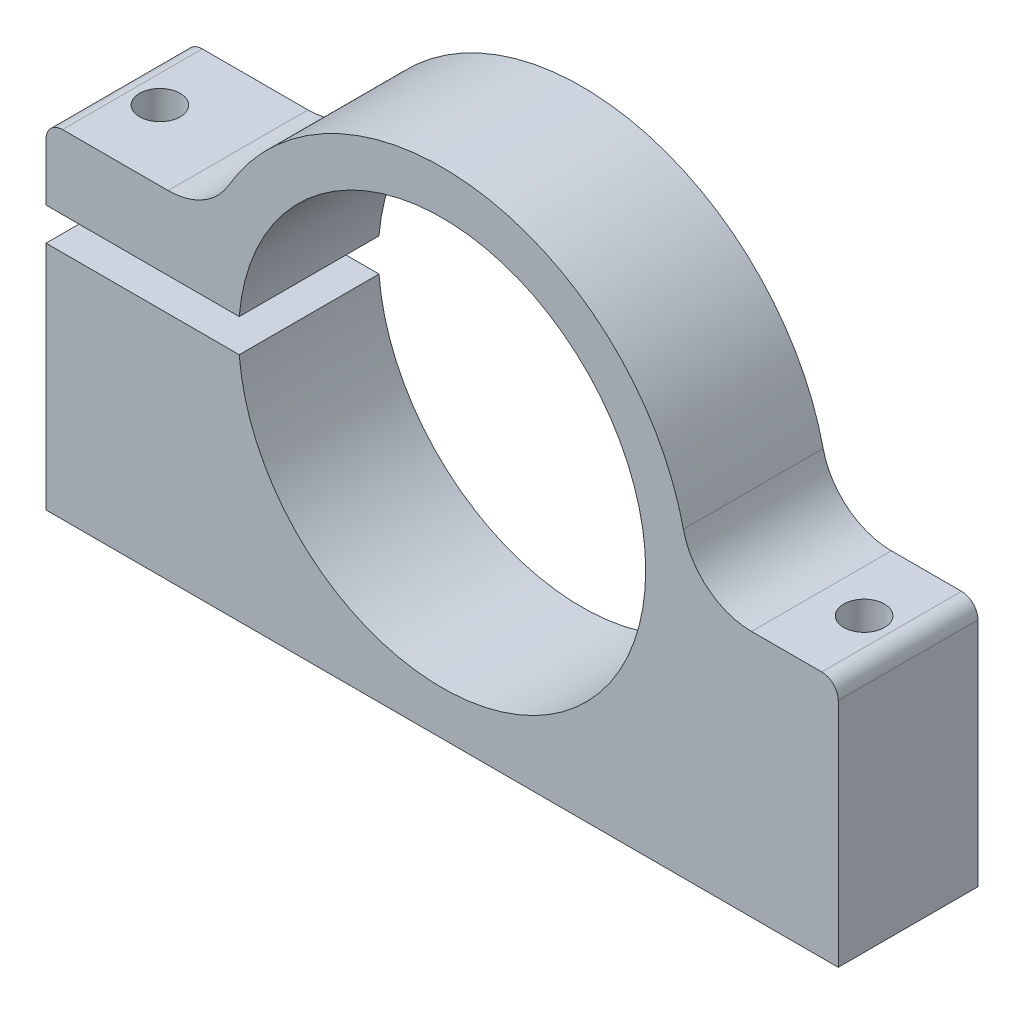
ISO-10303-21;
HEADER;
FILE_DESCRIPTION(('STEP AP214'),'2;1');
FILE_NAME('part.step','',(''),(''),'','','');
FILE_SCHEMA(('AUTOMOTIVE_DESIGN { 1 0 10303 214 1 1 1 1 }'));
ENDSEC;
DATA;
#1=APPLICATION_CONTEXT('core data for automotive mechanical design processes');
#2=APPLICATION_PROTOCOL_DEFINITION('international standard','automotive_design',2000,#1);
#3=PRODUCT_CONTEXT('',#1,'mechanical');
#4=PRODUCT('Part','Part','',(#3));
#5=PRODUCT_RELATED_PRODUCT_CATEGORY('part','',(#4));
#6=PRODUCT_DEFINITION_FORMATION('','',#4);
#7=PRODUCT_DEFINITION_CONTEXT('part definition',#1,'design');
#8=PRODUCT_DEFINITION('design','',#6,#7);
#9=PRODUCT_DEFINITION_SHAPE('','',#8);
#10=(LENGTH_UNIT() NAMED_UNIT(*) SI_UNIT(.MILLI.,.METRE.));
#11=(NAMED_UNIT(*) PLANE_ANGLE_UNIT() SI_UNIT($,.RADIAN.));
#12=(NAMED_UNIT(*) SI_UNIT($,.STERADIAN.) SOLID_ANGLE_UNIT());
#13=UNCERTAINTY_MEASURE_WITH_UNIT(LENGTH_MEASURE(1.E-05),#10,'distance_accuracy_value','');
#14=(GEOMETRIC_REPRESENTATION_CONTEXT(3) GLOBAL_UNCERTAINTY_ASSIGNED_CONTEXT((#13)) GLOBAL_UNIT_ASSIGNED_CONTEXT((#10,
#11,#12)) REPRESENTATION_CONTEXT('',''));
#15=CARTESIAN_POINT('',(0.,0.,0.));
#16=DIRECTION('',(0.,0.,1.));
#17=DIRECTION('',(1.,0.,0.));
#18=AXIS2_PLACEMENT_3D('',#15,#16,#17);
#19=CARTESIAN_POINT('',(2.74268845080234,-4.09970818546671,-8.09817712258498));
#20=DIRECTION('',(0.,1.,0.));
#21=DIRECTION('',(-1.,0.,0.));
#22=AXIS2_PLACEMENT_3D('',#19,#20,#21);
#23=PLANE('',#22);
#24=CARTESIAN_POINT('',(-0.495594242374321,-4.09970818546671,-5.94949587258498));
#25=DIRECTION('',(0.,1.,0.));
#26=DIRECTION('',(-1.,0.,0.));
#27=AXIS2_PLACEMENT_3D('',#24,#25,#26);
#28=CIRCLE('',#27,0.62599375);
#29=CARTESIAN_POINT('',(-1.12158799237432,-4.09970818546671,-5.94949587258498));
#30=VERTEX_POINT('',#29);
#31=EDGE_CURVE('E158',#30,#30,#28,.T.);
#32=ORIENTED_EDGE('',*,*,#31,.T.);
#33=EDGE_LOOP('',(#32));
#34=FACE_BOUND('',#33,.T.);
#35=DIRECTION('',(-1.,0.,0.));
#36=VECTOR('',#35,1.);
#37=CARTESIAN_POINT('',(2.74268845080234,-4.09970818546671,-3.80081462258498));
#38=LINE('',#37,#36);
#39=CARTESIAN_POINT('',(4.09307904615272,-4.09970818546671,-3.80081462258498));
#40=VERTEX_POINT('',#39);
#41=CARTESIAN_POINT('',(-1.84909424237432,-4.09970818546671,-3.80081462258498));
#42=VERTEX_POINT('',#41);
#43=EDGE_CURVE('E147',#40,#42,#38,.T.);
#44=ORIENTED_EDGE('',*,*,#43,.T.);
#45=DIRECTION('',(0.,0.,1.));
#46=VECTOR('',#45,1.);
#47=CARTESIAN_POINT('',(-1.84909424237432,-4.09970818546671,-8.09817712258498));
#48=LINE('',#47,#46);
#49=CARTESIAN_POINT('',(-1.84909424237432,-4.09970818546671,-8.09817712258498));
#50=VERTEX_POINT('',#49);
#51=EDGE_CURVE('E207',#50,#42,#48,.T.);
#52=ORIENTED_EDGE('',*,*,#51,.F.);
#53=DIRECTION('',(-1.,0.,0.));
#54=VECTOR('',#53,1.);
#55=CARTESIAN_POINT('',(2.74268845080234,-4.09970818546671,-8.09817712258498));
#56=LINE('',#55,#54);
#57=CARTESIAN_POINT('',(4.09307904615272,-4.09970818546671,-8.09817712258498));
#58=VERTEX_POINT('',#57);
#59=EDGE_CURVE('E186',#58,#50,#56,.T.);
#60=ORIENTED_EDGE('',*,*,#59,.F.);
#61=DIRECTION('',(0.,0.,1.));
#62=VECTOR('',#61,1.);
#63=CARTESIAN_POINT('',(4.09307904615272,-4.09970818546671,-8.09817712258498));
#64=LINE('',#63,#62);
#65=EDGE_CURVE('E157',#58,#40,#64,.T.);
#66=ORIENTED_EDGE('',*,*,#65,.T.);
#67=EDGE_LOOP('',(#44,#52,#60,#66));
#68=FACE_BOUND('',#67,.T.);
#69=ADVANCED_FACE('F36',(#34,#68),#23,.F.);
#70=CARTESIAN_POINT('',(-1.84909424237432,-4.09970818546671,-8.09817712258498));
#71=DIRECTION('',(1.,0.,0.));
#72=DIRECTION('',(0.,0.,-1.));
#73=AXIS2_PLACEMENT_3D('',#70,#71,#72);
#74=PLANE('',#73);
#75=DIRECTION('',(0.,1.,0.));
#76=VECTOR('',#75,1.);
#77=CARTESIAN_POINT('',(-1.84909424237432,-4.09970818546671,-3.80081462258498));
#78=LINE('',#77,#76);
#79=CARTESIAN_POINT('',(-1.84909424237432,-2.34319761645771,-3.80081462258498));
#80=VERTEX_POINT('',#79);
#81=EDGE_CURVE('E204',#42,#80,#78,.T.);
#82=ORIENTED_EDGE('',*,*,#81,.T.);
#83=DIRECTION('',(0.,0.,1.));
#84=VECTOR('',#83,1.);
#85=CARTESIAN_POINT('',(-1.84909424237432,-2.34319761645771,-8.09817712258498));
#86=LINE('',#85,#84);
#87=CARTESIAN_POINT('',(-1.84909424237432,-2.34319761645771,-8.09817712258498));
#88=VERTEX_POINT('',#87);
#89=EDGE_CURVE('E44',#80,#88,#86,.F.);
#90=ORIENTED_EDGE('',*,*,#89,.T.);
#91=DIRECTION('',(0.,1.,0.));
#92=VECTOR('',#91,1.);
#93=CARTESIAN_POINT('',(-1.84909424237432,-4.09970818546671,-8.09817712258498));
#94=LINE('',#93,#92);
#95=EDGE_CURVE('E184',#50,#88,#94,.T.);
#96=ORIENTED_EDGE('',*,*,#95,.F.);
#97=ORIENTED_EDGE('',*,*,#51,.T.);
#98=EDGE_LOOP('',(#82,#90,#96,#97));
#99=FACE_BOUND('',#98,.T.);
#100=ADVANCED_FACE('F328',(#99),#74,.F.);
#101=CARTESIAN_POINT('',(-1.84909424237432,-1.83563511645771,-8.09817712258498));
#102=DIRECTION('',(0.,-1.,0.));
#103=DIRECTION('',(1.,0.,0.));
#104=AXIS2_PLACEMENT_3D('',#101,#102,#103);
#105=PLANE('',#104);
#106=CARTESIAN_POINT('',(-0.495594242374319,-1.83563511645771,-5.94949587258498));
#107=DIRECTION('',(0.,1.,0.));
#108=DIRECTION('',(-1.,0.,0.));
#109=AXIS2_PLACEMENT_3D('',#106,#107,#108);
#110=CIRCLE('',#109,0.62599375);
#111=CARTESIAN_POINT('',(-1.12158799237432,-1.83563511645771,-5.94949587258498));
#112=VERTEX_POINT('',#111);
#113=EDGE_CURVE('E297',#112,#112,#110,.T.);
#114=ORIENTED_EDGE('',*,*,#113,.F.);
#115=EDGE_LOOP('',(#114));
#116=FACE_BOUND('',#115,.T.);
#117=DIRECTION('',(1.,0.,0.));
#118=VECTOR('',#117,1.);
#119=CARTESIAN_POINT('',(-1.84909424237432,-1.83563511645771,-8.09817712258498));
#120=LINE('',#119,#118);
#121=CARTESIAN_POINT('',(-1.34153174237432,-1.83563511645771,-8.09817712258498));
#122=VERTEX_POINT('',#121);
#123=CARTESIAN_POINT('',(1.90878655852523,-1.83563511645771,-8.09817712258498));
#124=VERTEX_POINT('',#123);
#125=EDGE_CURVE('E182',#122,#124,#120,.T.);
#126=ORIENTED_EDGE('',*,*,#125,.F.);
#127=DIRECTION('',(0.,0.,1.));
#128=VECTOR('',#127,1.);
#129=CARTESIAN_POINT('',(-1.34153174237432,-1.83563511645771,-8.09817712258498));
#130=LINE('',#129,#128);
#131=CARTESIAN_POINT('',(-1.34153174237432,-1.83563511645771,-3.80081462258498));
#132=VERTEX_POINT('',#131);
#133=EDGE_CURVE('E249',#122,#132,#130,.T.);
#134=ORIENTED_EDGE('',*,*,#133,.T.);
#135=DIRECTION('',(1.,0.,0.));
#136=VECTOR('',#135,1.);
#137=CARTESIAN_POINT('',(-1.84909424237432,-1.83563511645771,-3.80081462258498));
#138=LINE('',#137,#136);
#139=CARTESIAN_POINT('',(1.90878655852523,-1.83563511645771,-3.80081462258498));
#140=VERTEX_POINT('',#139);
#141=EDGE_CURVE('E202',#132,#140,#138,.T.);
#142=ORIENTED_EDGE('',*,*,#141,.T.);
#143=DIRECTION('',(0.,0.,1.));
#144=VECTOR('',#143,1.);
#145=CARTESIAN_POINT('',(1.90878655852523,-1.83563511645771,-8.09817712258498));
#146=LINE('',#145,#144);
#147=EDGE_CURVE('E232',#140,#124,#146,.F.);
#148=ORIENTED_EDGE('',*,*,#147,.T.);
#149=EDGE_LOOP('',(#126,#134,#142,#148));
#150=FACE_BOUND('',#149,.T.);
#151=ADVANCED_FACE('F255',(#116,#150),#105,.F.);
#152=CARTESIAN_POINT('',(10.3324057576257,-4.60727068546671,-8.09817712258498));
#153=DIRECTION('',(0.,0.,1.));
#154=DIRECTION('',(1.,0.,0.));
#155=AXIS2_PLACEMENT_3D('',#152,#153,#154);
#156=CYLINDRICAL_SURFACE('',#155,7.60667);
#157=CARTESIAN_POINT('',(10.3324057576257,-4.60727068546671,-8.09817712258498));
#158=DIRECTION('',(0.,0.,1.));
#159=DIRECTION('',(1.,0.,0.));
#160=AXIS2_PLACEMENT_3D('',#157,#158,#159);
#161=CIRCLE('',#160,7.60667);
#162=CARTESIAN_POINT('',(17.7522707691359,-2.93185082767969,-8.09817712258498));
#163=VERTEX_POINT('',#162);
#164=CARTESIAN_POINT('',(3.76414493224316,-0.770686499156537,-8.09817712258498));
#165=VERTEX_POINT('',#164);
#166=EDGE_CURVE('E179',#163,#165,#161,.T.);
#167=ORIENTED_EDGE('',*,*,#166,.T.);
#168=DIRECTION('',(0.,0.,1.));
#169=VECTOR('',#168,1.);
#170=CARTESIAN_POINT('',(3.76414493224316,-0.770686499156537,-8.09817712258498));
#171=LINE('',#170,#169);
#172=CARTESIAN_POINT('',(3.76414493224316,-0.770686499156537,-3.80081462258498));
#173=VERTEX_POINT('',#172);
#174=EDGE_CURVE('E229',#165,#173,#171,.T.);
#175=ORIENTED_EDGE('',*,*,#174,.T.);
#176=CARTESIAN_POINT('',(10.3324057576257,-4.60727068546671,-3.80081462258498));
#177=DIRECTION('',(0.,0.,1.));
#178=DIRECTION('',(1.,0.,0.));
#179=AXIS2_PLACEMENT_3D('',#176,#177,#178);
#180=CIRCLE('',#179,7.60667);
#181=CARTESIAN_POINT('',(17.7522707691359,-2.93185082767969,-3.80081462258498));
#182=VERTEX_POINT('',#181);
#183=EDGE_CURVE('E199',#182,#173,#180,.T.);
#184=ORIENTED_EDGE('',*,*,#183,.F.);
#185=DIRECTION('',(0.,0.,1.));
#186=VECTOR('',#185,1.);
#187=CARTESIAN_POINT('',(17.7522707691359,-2.93185082767969,-8.09817712258498));
#188=LINE('',#187,#186);
#189=EDGE_CURVE('E222',#182,#163,#188,.F.);
#190=ORIENTED_EDGE('',*,*,#189,.T.);
#191=EDGE_LOOP('',(#167,#175,#184,#190));
#192=FACE_BOUND('',#191,.T.);
#193=ADVANCED_FACE('F268',(#192),#156,.T.);
#194=CARTESIAN_POINT('',(22.5139057576257,-4.60727068546671,-8.09817712258498));
#195=DIRECTION('',(0.,1.,0.));
#196=DIRECTION('',(-1.,0.,0.));
#197=AXIS2_PLACEMENT_3D('',#194,#195,#196);
#198=PLANE('',#197);
#199=CARTESIAN_POINT('',(21.1604057576257,-4.60727068546671,-5.94949587258498));
#200=DIRECTION('',(0.,1.,0.));
#201=DIRECTION('',(-1.,0.,0.));
#202=AXIS2_PLACEMENT_3D('',#199,#200,#201);
#203=CIRCLE('',#202,0.625993749999999);
#204=CARTESIAN_POINT('',(20.5344120076257,-4.60727068546671,-5.94949587258498));
#205=VERTEX_POINT('',#204);
#206=EDGE_CURVE('E303',#205,#205,#203,.T.);
#207=ORIENTED_EDGE('',*,*,#206,.F.);
#208=EDGE_LOOP('',(#207));
#209=FACE_BOUND('',#208,.T.);
#210=DIRECTION('',(-1.,0.,0.));
#211=VECTOR('',#210,1.);
#212=CARTESIAN_POINT('',(22.5139057576257,-4.60727068546671,-3.80081462258498));
#213=LINE('',#212,#211);
#214=CARTESIAN_POINT('',(22.0063432576257,-4.60727068546671,-3.80081462258498));
#215=VERTEX_POINT('',#214);
#216=CARTESIAN_POINT('',(19.8481845957858,-4.60727068546671,-3.80081462258498));
#217=VERTEX_POINT('',#216);
#218=EDGE_CURVE('E197',#215,#217,#213,.T.);
#219=ORIENTED_EDGE('',*,*,#218,.F.);
#220=DIRECTION('',(0.,0.,1.));
#221=VECTOR('',#220,1.);
#222=CARTESIAN_POINT('',(22.0063432576257,-4.60727068546671,-8.09817712258498));
#223=LINE('',#222,#221);
#224=CARTESIAN_POINT('',(22.0063432576257,-4.60727068546671,-8.09817712258498));
#225=VERTEX_POINT('',#224);
#226=EDGE_CURVE('E245',#215,#225,#223,.F.);
#227=ORIENTED_EDGE('',*,*,#226,.T.);
#228=DIRECTION('',(-1.,0.,0.));
#229=VECTOR('',#228,1.);
#230=CARTESIAN_POINT('',(22.5139057576257,-4.60727068546671,-8.09817712258498));
#231=LINE('',#230,#229);
#232=CARTESIAN_POINT('',(19.8481845957858,-4.60727068546671,-8.09817712258498));
#233=VERTEX_POINT('',#232);
#234=EDGE_CURVE('E177',#225,#233,#231,.T.);
#235=ORIENTED_EDGE('',*,*,#234,.T.);
#236=DIRECTION('',(0.,0.,-1.));
#237=VECTOR('',#236,1.);
#238=CARTESIAN_POINT('',(19.8481845957858,-4.60727068546671,-3.80081462258498));
#239=LINE('',#238,#237);
#240=EDGE_CURVE('E210',#233,#217,#239,.F.);
#241=ORIENTED_EDGE('',*,*,#240,.T.);
#242=EDGE_LOOP('',(#219,#227,#235,#241));
#243=FACE_BOUND('',#242,.T.);
#244=ADVANCED_FACE('F318',(#209,#243),#198,.T.);
#245=CARTESIAN_POINT('',(22.5139057576257,-12.2207081854667,-8.09817712258498));
#246=DIRECTION('',(1.,0.,0.));
#247=DIRECTION('',(0.,1.,0.));
#248=AXIS2_PLACEMENT_3D('',#245,#246,#247);
#249=PLANE('',#248);
#250=DIRECTION('',(0.,1.,0.));
#251=VECTOR('',#250,1.);
#252=CARTESIAN_POINT('',(22.5139057576257,-12.2207081854667,-8.09817712258498));
#253=LINE('',#252,#251);
#254=CARTESIAN_POINT('',(22.5139057576257,-12.2207081854667,-8.09817712258498));
#255=VERTEX_POINT('',#254);
#256=CARTESIAN_POINT('',(22.5139057576257,-5.11483318546671,-8.09817712258498));
#257=VERTEX_POINT('',#256);
#258=EDGE_CURVE('E174',#255,#257,#253,.T.);
#259=ORIENTED_EDGE('',*,*,#258,.T.);
#260=DIRECTION('',(0.,0.,1.));
#261=VECTOR('',#260,1.);
#262=CARTESIAN_POINT('',(22.5139057576257,-5.11483318546671,-8.09817712258498));
#263=LINE('',#262,#261);
#264=CARTESIAN_POINT('',(22.5139057576257,-5.11483318546671,-3.80081462258498));
#265=VERTEX_POINT('',#264);
#266=EDGE_CURVE('E240',#257,#265,#263,.T.);
#267=ORIENTED_EDGE('',*,*,#266,.T.);
#268=DIRECTION('',(0.,1.,0.));
#269=VECTOR('',#268,1.);
#270=CARTESIAN_POINT('',(22.5139057576257,-12.2207081854667,-3.80081462258498));
#271=LINE('',#270,#269);
#272=CARTESIAN_POINT('',(22.5139057576257,-12.2207081854667,-3.80081462258498));
#273=VERTEX_POINT('',#272);
#274=EDGE_CURVE('E194',#273,#265,#271,.T.);
#275=ORIENTED_EDGE('',*,*,#274,.F.);
#276=DIRECTION('',(0.,0.,1.));
#277=VECTOR('',#276,1.);
#278=CARTESIAN_POINT('',(22.5139057576257,-12.2207081854667,-8.09817712258498));
#279=LINE('',#278,#277);
#280=EDGE_CURVE('E211',#255,#273,#279,.T.);
#281=ORIENTED_EDGE('',*,*,#280,.F.);
#282=EDGE_LOOP('',(#259,#267,#275,#281));
#283=FACE_BOUND('',#282,.T.);
#284=ADVANCED_FACE('F284',(#283),#249,.T.);
#285=CARTESIAN_POINT('',(-1.84909424237432,-12.2207081854667,-8.09817712258498));
#286=DIRECTION('',(0.,-1.,0.));
#287=DIRECTION('',(0.,0.,-1.));
#288=AXIS2_PLACEMENT_3D('',#285,#286,#287);
#289=PLANE('',#288);
#290=CARTESIAN_POINT('',(21.1604057576257,-12.2207081854667,-5.94949587258498));
#291=DIRECTION('',(0.,1.,0.));
#292=DIRECTION('',(-1.,0.,0.));
#293=AXIS2_PLACEMENT_3D('',#290,#291,#292);
#294=CIRCLE('',#293,0.625993749999999);
#295=CARTESIAN_POINT('',(20.5344120076257,-12.2207081854667,-5.94949587258498));
#296=VERTEX_POINT('',#295);
#297=EDGE_CURVE('E300',#296,#296,#294,.T.);
#298=ORIENTED_EDGE('',*,*,#297,.T.);
#299=EDGE_LOOP('',(#298));
#300=FACE_BOUND('',#299,.T.);
#301=CARTESIAN_POINT('',(-0.495594242374321,-12.2207081854667,-5.94949587258498));
#302=DIRECTION('',(0.,1.,0.));
#303=DIRECTION('',(-1.,0.,0.));
#304=AXIS2_PLACEMENT_3D('',#301,#302,#303);
#305=CIRCLE('',#304,0.62599375);
#306=CARTESIAN_POINT('',(-1.12158799237432,-12.2207081854667,-5.94949587258498));
#307=VERTEX_POINT('',#306);
#308=EDGE_CURVE('E219',#307,#307,#305,.T.);
#309=ORIENTED_EDGE('',*,*,#308,.T.);
#310=EDGE_LOOP('',(#309));
#311=FACE_BOUND('',#310,.T.);
#312=DIRECTION('',(1.,0.,0.));
#313=VECTOR('',#312,1.);
#314=CARTESIAN_POINT('',(-1.84909424237432,-12.2207081854667,-3.80081462258498));
#315=LINE('',#314,#313);
#316=CARTESIAN_POINT('',(-1.84909424237432,-12.2207081854667,-3.80081462258498));
#317=VERTEX_POINT('',#316);
#318=EDGE_CURVE('E191',#317,#273,#315,.T.);
#319=ORIENTED_EDGE('',*,*,#318,.F.);
#320=DIRECTION('',(0.,0.,1.));
#321=VECTOR('',#320,1.);
#322=CARTESIAN_POINT('',(-1.84909424237432,-12.2207081854667,-8.09817712258498));
#323=LINE('',#322,#321);
#324=CARTESIAN_POINT('',(-1.84909424237432,-12.2207081854667,-8.09817712258498));
#325=VERTEX_POINT('',#324);
#326=EDGE_CURVE('E213',#325,#317,#323,.T.);
#327=ORIENTED_EDGE('',*,*,#326,.F.);
#328=DIRECTION('',(1.,0.,0.));
#329=VECTOR('',#328,1.);
#330=CARTESIAN_POINT('',(-1.84909424237432,-12.2207081854667,-8.09817712258498));
#331=LINE('',#330,#329);
#332=EDGE_CURVE('E171',#325,#255,#331,.T.);
#333=ORIENTED_EDGE('',*,*,#332,.T.);
#334=ORIENTED_EDGE('',*,*,#280,.T.);
#335=EDGE_LOOP('',(#319,#327,#333,#334));
#336=FACE_BOUND('',#335,.T.);
#337=ADVANCED_FACE('F289',(#300,#311,#336),#289,.T.);
#338=CARTESIAN_POINT('',(-1.84909424237432,-5.11483318546671,-8.09817712258498));
#339=DIRECTION('',(-1.,0.,0.));
#340=DIRECTION('',(0.,-1.,0.));
#341=AXIS2_PLACEMENT_3D('',#338,#339,#340);
#342=PLANE('',#341);
#343=DIRECTION('',(0.,-1.,0.));
#344=VECTOR('',#343,1.);
#345=CARTESIAN_POINT('',(-1.84909424237432,-5.11483318546671,-3.80081462258498));
#346=LINE('',#345,#344);
#347=CARTESIAN_POINT('',(-1.84909424237432,-5.11483318546671,-3.80081462258498));
#348=VERTEX_POINT('',#347);
#349=EDGE_CURVE('E165',#348,#317,#346,.T.);
#350=ORIENTED_EDGE('',*,*,#349,.F.);
#351=DIRECTION('',(0.,0.,1.));
#352=VECTOR('',#351,1.);
#353=CARTESIAN_POINT('',(-1.84909424237432,-5.11483318546671,-8.09817712258498));
#354=LINE('',#353,#352);
#355=CARTESIAN_POINT('',(-1.84909424237432,-5.11483318546671,-8.09817712258498));
#356=VERTEX_POINT('',#355);
#357=EDGE_CURVE('E187',#356,#348,#354,.T.);
#358=ORIENTED_EDGE('',*,*,#357,.F.);
#359=DIRECTION('',(0.,-1.,0.));
#360=VECTOR('',#359,1.);
#361=CARTESIAN_POINT('',(-1.84909424237432,-5.11483318546671,-8.09817712258498));
#362=LINE('',#361,#360);
#363=EDGE_CURVE('E145',#356,#325,#362,.T.);
#364=ORIENTED_EDGE('',*,*,#363,.T.);
#365=ORIENTED_EDGE('',*,*,#326,.T.);
#366=EDGE_LOOP('',(#350,#358,#364,#365));
#367=FACE_BOUND('',#366,.T.);
#368=ADVANCED_FACE('F291',(#367),#342,.T.);
#369=CARTESIAN_POINT('',(2.74268845080234,-5.11483318546671,-8.09817712258498));
#370=DIRECTION('',(0.,1.,0.));
#371=DIRECTION('',(-1.,0.,0.));
#372=AXIS2_PLACEMENT_3D('',#369,#370,#371);
#373=PLANE('',#372);
#374=CARTESIAN_POINT('',(-0.495594242374321,-5.11483318546671,-5.94949587258498));
#375=DIRECTION('',(0.,1.,0.));
#376=DIRECTION('',(-1.,0.,0.));
#377=AXIS2_PLACEMENT_3D('',#374,#375,#376);
#378=CIRCLE('',#377,0.62599375);
#379=CARTESIAN_POINT('',(-1.12158799237432,-5.11483318546671,-5.94949587258498));
#380=VERTEX_POINT('',#379);
#381=EDGE_CURVE('E216',#380,#380,#378,.T.);
#382=ORIENTED_EDGE('',*,*,#381,.F.);
#383=EDGE_LOOP('',(#382));
#384=FACE_BOUND('',#383,.T.);
#385=DIRECTION('',(-1.,0.,0.));
#386=VECTOR('',#385,1.);
#387=CARTESIAN_POINT('',(2.74268845080234,-5.11483318546671,-3.80081462258498));
#388=LINE('',#387,#386);
#389=CARTESIAN_POINT('',(4.09307904615272,-5.11483318546673,-3.80081462258498));
#390=VERTEX_POINT('',#389);
#391=EDGE_CURVE('E153',#390,#348,#388,.T.);
#392=ORIENTED_EDGE('',*,*,#391,.F.);
#393=DIRECTION('',(0.,0.,1.));
#394=VECTOR('',#393,1.);
#395=CARTESIAN_POINT('',(4.09307904615272,-5.11483318546671,-8.09817712258498));
#396=LINE('',#395,#394);
#397=CARTESIAN_POINT('',(4.09307904615272,-5.11483318546671,-8.09817712258498));
#398=VERTEX_POINT('',#397);
#399=EDGE_CURVE('E150',#398,#390,#396,.T.);
#400=ORIENTED_EDGE('',*,*,#399,.F.);
#401=DIRECTION('',(-1.,0.,0.));
#402=VECTOR('',#401,1.);
#403=CARTESIAN_POINT('',(2.74268845080234,-5.11483318546671,-8.09817712258498));
#404=LINE('',#403,#402);
#405=EDGE_CURVE('E138',#398,#356,#404,.T.);
#406=ORIENTED_EDGE('',*,*,#405,.T.);
#407=ORIENTED_EDGE('',*,*,#357,.T.);
#408=EDGE_LOOP('',(#392,#400,#406,#407));
#409=FACE_BOUND('',#408,.T.);
#410=ADVANCED_FACE('F151',(#384,#409),#373,.T.);
#411=CARTESIAN_POINT('',(10.3324057576257,-4.60727068546671,-8.09817712258498));
#412=DIRECTION('',(0.,0.,1.));
#413=DIRECTION('',(1.,0.,0.));
#414=AXIS2_PLACEMENT_3D('',#411,#412,#413);
#415=PLANE('',#414);
#416=ORIENTED_EDGE('',*,*,#95,.T.);
#417=CARTESIAN_POINT('',(-1.34153174237432,-2.34319761645771,-8.09817712258498));
#418=DIRECTION('',(0.,0.,1.));
#419=DIRECTION('',(1.,0.,0.));
#420=AXIS2_PLACEMENT_3D('',#417,#418,#419);
#421=CIRCLE('',#420,0.5075625);
#422=EDGE_CURVE('E11',#88,#122,#421,.F.);
#423=ORIENTED_EDGE('',*,*,#422,.T.);
#424=ORIENTED_EDGE('',*,*,#125,.T.);
#425=CARTESIAN_POINT('',(1.90878655852523,0.313046133542289,-8.09817712258498));
#426=DIRECTION('',(0.,0.,1.));
#427=DIRECTION('',(1.,0.,0.));
#428=AXIS2_PLACEMENT_3D('',#425,#426,#427);
#429=CIRCLE('',#428,2.14868125);
#430=EDGE_CURVE('E238',#124,#165,#429,.T.);
#431=ORIENTED_EDGE('',*,*,#430,.T.);
#432=ORIENTED_EDGE('',*,*,#166,.F.);
#433=CARTESIAN_POINT('',(19.8481845957858,-2.45858943546671,-8.09817712258498));
#434=DIRECTION('',(0.,0.,1.));
#435=DIRECTION('',(1.,0.,0.));
#436=AXIS2_PLACEMENT_3D('',#433,#434,#435);
#437=CIRCLE('',#436,2.14868125);
#438=EDGE_CURVE('E226',#163,#233,#437,.T.);
#439=ORIENTED_EDGE('',*,*,#438,.T.);
#440=ORIENTED_EDGE('',*,*,#234,.F.);
#441=CARTESIAN_POINT('',(22.0063432576257,-5.11483318546671,-8.09817712258498));
#442=DIRECTION('',(0.,0.,1.));
#443=DIRECTION('',(1.,0.,0.));
#444=AXIS2_PLACEMENT_3D('',#441,#442,#443);
#445=CIRCLE('',#444,0.5075625);
#446=EDGE_CURVE('E247',#225,#257,#445,.F.);
#447=ORIENTED_EDGE('',*,*,#446,.T.);
#448=ORIENTED_EDGE('',*,*,#258,.F.);
#449=ORIENTED_EDGE('',*,*,#332,.F.);
#450=ORIENTED_EDGE('',*,*,#363,.F.);
#451=ORIENTED_EDGE('',*,*,#405,.F.);
#452=CARTESIAN_POINT('',(10.3324057576257,-4.60727068546671,-8.09817712258498));
#453=DIRECTION('',(0.,0.,1.));
#454=DIRECTION('',(1.,0.,0.));
#455=AXIS2_PLACEMENT_3D('',#452,#453,#454);
#456=CIRCLE('',#455,6.2599375);
#457=EDGE_CURVE('E142',#398,#58,#456,.T.);
#458=ORIENTED_EDGE('',*,*,#457,.T.);
#459=ORIENTED_EDGE('',*,*,#59,.T.);
#460=EDGE_LOOP('',(#416,#423,#424,#431,#432,#439,#440,#447,#448,#449,#450,#451,#458,#459));
#461=FACE_BOUND('',#460,.T.);
#462=ADVANCED_FACE('F140',(#461),#415,.F.);
#463=CARTESIAN_POINT('',(10.3324057576257,-4.60727068546671,-3.80081462258498));
#464=DIRECTION('',(0.,0.,1.));
#465=DIRECTION('',(1.,0.,0.));
#466=AXIS2_PLACEMENT_3D('',#463,#464,#465);
#467=PLANE('',#466);
#468=ORIENTED_EDGE('',*,*,#141,.F.);
#469=CARTESIAN_POINT('',(-1.34153174237432,-2.34319761645771,-3.80081462258498));
#470=DIRECTION('',(0.,0.,1.));
#471=DIRECTION('',(1.,0.,0.));
#472=AXIS2_PLACEMENT_3D('',#469,#470,#471);
#473=CIRCLE('',#472,0.5075625);
#474=EDGE_CURVE('E58',#132,#80,#473,.T.);
#475=ORIENTED_EDGE('',*,*,#474,.T.);
#476=ORIENTED_EDGE('',*,*,#81,.F.);
#477=ORIENTED_EDGE('',*,*,#43,.F.);
#478=CARTESIAN_POINT('',(10.3324057576257,-4.60727068546671,-3.80081462258498));
#479=DIRECTION('',(0.,0.,1.));
#480=DIRECTION('',(1.,0.,0.));
#481=AXIS2_PLACEMENT_3D('',#478,#479,#480);
#482=CIRCLE('',#481,6.2599375);
#483=EDGE_CURVE('E163',#390,#40,#482,.T.);
#484=ORIENTED_EDGE('',*,*,#483,.F.);
#485=ORIENTED_EDGE('',*,*,#391,.T.);
#486=ORIENTED_EDGE('',*,*,#349,.T.);
#487=ORIENTED_EDGE('',*,*,#318,.T.);
#488=ORIENTED_EDGE('',*,*,#274,.T.);
#489=CARTESIAN_POINT('',(22.0063432576257,-5.11483318546671,-3.80081462258498));
#490=DIRECTION('',(0.,0.,1.));
#491=DIRECTION('',(1.,0.,0.));
#492=AXIS2_PLACEMENT_3D('',#489,#490,#491);
#493=CIRCLE('',#492,0.5075625);
#494=EDGE_CURVE('E243',#265,#215,#493,.T.);
#495=ORIENTED_EDGE('',*,*,#494,.T.);
#496=ORIENTED_EDGE('',*,*,#218,.T.);
#497=CARTESIAN_POINT('',(19.8481845957858,-2.45858943546671,-3.80081462258498));
#498=DIRECTION('',(0.,0.,1.));
#499=DIRECTION('',(1.,0.,0.));
#500=AXIS2_PLACEMENT_3D('',#497,#498,#499);
#501=CIRCLE('',#500,2.14868125);
#502=EDGE_CURVE('E224',#217,#182,#501,.F.);
#503=ORIENTED_EDGE('',*,*,#502,.T.);
#504=ORIENTED_EDGE('',*,*,#183,.T.);
#505=CARTESIAN_POINT('',(1.90878655852523,0.313046133542289,-3.80081462258498));
#506=DIRECTION('',(0.,0.,1.));
#507=DIRECTION('',(1.,0.,0.));
#508=AXIS2_PLACEMENT_3D('',#505,#506,#507);
#509=CIRCLE('',#508,2.14868125);
#510=EDGE_CURVE('E235',#173,#140,#509,.F.);
#511=ORIENTED_EDGE('',*,*,#510,.T.);
#512=EDGE_LOOP('',(#468,#475,#476,#477,#484,#485,#486,#487,#488,#495,#496,#503,#504,#511));
#513=FACE_BOUND('',#512,.T.);
#514=ADVANCED_FACE('F258',(#513),#467,.T.);
#515=CARTESIAN_POINT('',(10.3324057576257,-4.60727068546671,-8.09817712258498));
#516=DIRECTION('',(0.,0.,1.));
#517=DIRECTION('',(1.,0.,0.));
#518=AXIS2_PLACEMENT_3D('',#515,#516,#517);
#519=CYLINDRICAL_SURFACE('',#518,6.2599375);
#520=ORIENTED_EDGE('',*,*,#483,.T.);
#521=ORIENTED_EDGE('',*,*,#65,.F.);
#522=ORIENTED_EDGE('',*,*,#457,.F.);
#523=ORIENTED_EDGE('',*,*,#399,.T.);
#524=EDGE_LOOP('',(#520,#521,#522,#523));
#525=FACE_BOUND('',#524,.T.);
#526=ADVANCED_FACE('F161',(#525),#519,.F.);
#527=CARTESIAN_POINT('',(-0.495594242374321,-12.2207081854667,-5.94949587258498));
#528=DIRECTION('',(0.,1.,0.));
#529=DIRECTION('',(-1.,0.,0.));
#530=AXIS2_PLACEMENT_3D('',#527,#528,#529);
#531=CYLINDRICAL_SURFACE('',#530,0.62599375);
#532=ORIENTED_EDGE('',*,*,#381,.T.);
#533=EDGE_LOOP('',(#532));
#534=FACE_BOUND('',#533,.T.);
#535=ORIENTED_EDGE('',*,*,#308,.F.);
#536=EDGE_LOOP('',(#535));
#537=FACE_BOUND('',#536,.T.);
#538=ADVANCED_FACE('F346',(#534,#537),#531,.F.);
#539=ORIENTED_EDGE('',*,*,#113,.T.);
#540=EDGE_LOOP('',(#539));
#541=FACE_BOUND('',#540,.T.);
#542=ORIENTED_EDGE('',*,*,#31,.F.);
#543=EDGE_LOOP('',(#542));
#544=FACE_BOUND('',#543,.T.);
#545=ADVANCED_FACE('F314',(#541,#544),#531,.F.);
#546=CARTESIAN_POINT('',(21.1604057576257,-12.2207081854667,-5.94949587258498));
#547=DIRECTION('',(0.,1.,0.));
#548=DIRECTION('',(-1.,0.,0.));
#549=AXIS2_PLACEMENT_3D('',#546,#547,#548);
#550=CYLINDRICAL_SURFACE('',#549,0.625993749999999);
#551=ORIENTED_EDGE('',*,*,#297,.F.);
#552=EDGE_LOOP('',(#551));
#553=FACE_BOUND('',#552,.T.);
#554=ORIENTED_EDGE('',*,*,#206,.T.);
#555=EDGE_LOOP('',(#554));
#556=FACE_BOUND('',#555,.T.);
#557=ADVANCED_FACE('F311',(#553,#556),#550,.F.);
#558=CARTESIAN_POINT('',(19.8481845957858,-2.45858943546671,-8.09817712258498));
#559=DIRECTION('',(0.,0.,1.));
#560=DIRECTION('',(1.,0.,0.));
#561=AXIS2_PLACEMENT_3D('',#558,#559,#560);
#562=CYLINDRICAL_SURFACE('',#561,2.14868125);
#563=ORIENTED_EDGE('',*,*,#438,.F.);
#564=ORIENTED_EDGE('',*,*,#189,.F.);
#565=ORIENTED_EDGE('',*,*,#502,.F.);
#566=ORIENTED_EDGE('',*,*,#240,.F.);
#567=EDGE_LOOP('',(#563,#564,#565,#566));
#568=FACE_BOUND('',#567,.T.);
#569=ADVANCED_FACE('F272',(#568),#562,.F.);
#570=CARTESIAN_POINT('',(1.90878655852523,0.313046133542289,-8.09817712258498));
#571=DIRECTION('',(0.,0.,1.));
#572=DIRECTION('',(1.,0.,0.));
#573=AXIS2_PLACEMENT_3D('',#570,#571,#572);
#574=CYLINDRICAL_SURFACE('',#573,2.14868125);
#575=ORIENTED_EDGE('',*,*,#430,.F.);
#576=ORIENTED_EDGE('',*,*,#147,.F.);
#577=ORIENTED_EDGE('',*,*,#510,.F.);
#578=ORIENTED_EDGE('',*,*,#174,.F.);
#579=EDGE_LOOP('',(#575,#576,#577,#578));
#580=FACE_BOUND('',#579,.T.);
#581=ADVANCED_FACE('F264',(#580),#574,.F.);
#582=CARTESIAN_POINT('',(22.0063432576257,-5.11483318546671,-8.09817712258498));
#583=DIRECTION('',(0.,0.,1.));
#584=DIRECTION('',(1.,0.,0.));
#585=AXIS2_PLACEMENT_3D('',#582,#583,#584);
#586=CYLINDRICAL_SURFACE('',#585,0.5075625);
#587=ORIENTED_EDGE('',*,*,#446,.F.);
#588=ORIENTED_EDGE('',*,*,#226,.F.);
#589=ORIENTED_EDGE('',*,*,#494,.F.);
#590=ORIENTED_EDGE('',*,*,#266,.F.);
#591=EDGE_LOOP('',(#587,#588,#589,#590));
#592=FACE_BOUND('',#591,.T.);
#593=ADVANCED_FACE('F281',(#592),#586,.T.);
#594=CARTESIAN_POINT('',(-1.34153174237432,-2.34319761645771,-8.09817712258498));
#595=DIRECTION('',(0.,0.,1.));
#596=DIRECTION('',(1.,0.,0.));
#597=AXIS2_PLACEMENT_3D('',#594,#595,#596);
#598=CYLINDRICAL_SURFACE('',#597,0.5075625);
#599=ORIENTED_EDGE('',*,*,#422,.F.);
#600=ORIENTED_EDGE('',*,*,#89,.F.);
#601=ORIENTED_EDGE('',*,*,#474,.F.);
#602=ORIENTED_EDGE('',*,*,#133,.F.);
#603=EDGE_LOOP('',(#599,#600,#601,#602));
#604=FACE_BOUND('',#603,.T.);
#605=ADVANCED_FACE('F38',(#604),#598,.T.);
#606=CLOSED_SHELL('',(#69,#100,#151,#193,#244,#284,#337,#368,#410,#462,#514,#526,#538,#545,#557,
#569,#581,#593,#605));
#607=MANIFOLD_SOLID_BREP('B2',#606);
#608=ADVANCED_BREP_SHAPE_REPRESENTATION('',(#18,#607),#14);
#609=SHAPE_DEFINITION_REPRESENTATION(#9,#608);
ENDSEC;
END-ISO-10303-21;
